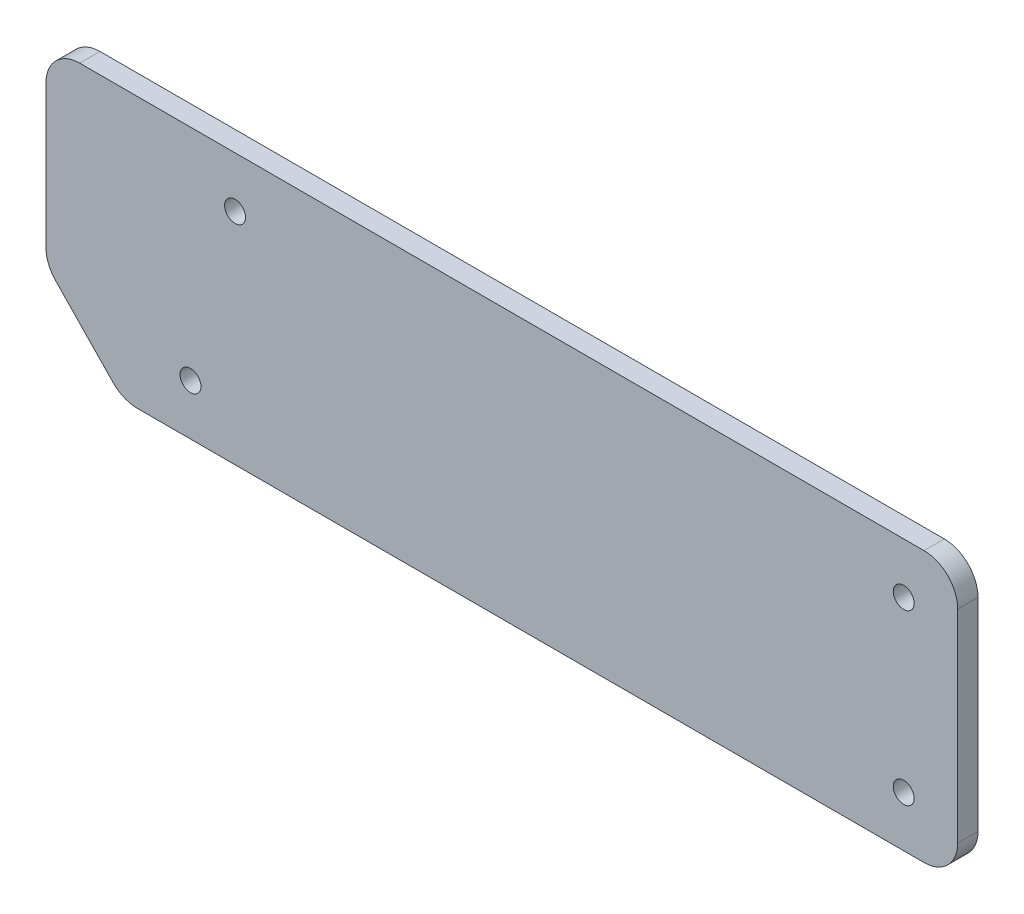
ISO-10303-21;
HEADER;
FILE_DESCRIPTION(('STEP AP214'),'2;1');
FILE_NAME('part.step','',(''),(''),'','','');
FILE_SCHEMA(('AUTOMOTIVE_DESIGN { 1 0 10303 214 1 1 1 1 }'));
ENDSEC;
DATA;
#1=APPLICATION_CONTEXT('core data for automotive mechanical design processes');
#2=APPLICATION_PROTOCOL_DEFINITION('international standard','automotive_design',2000,#1);
#3=PRODUCT_CONTEXT('',#1,'mechanical');
#4=PRODUCT('Part','Part','',(#3));
#5=PRODUCT_RELATED_PRODUCT_CATEGORY('part','',(#4));
#6=PRODUCT_DEFINITION_FORMATION('','',#4);
#7=PRODUCT_DEFINITION_CONTEXT('part definition',#1,'design');
#8=PRODUCT_DEFINITION('design','',#6,#7);
#9=PRODUCT_DEFINITION_SHAPE('','',#8);
#10=(LENGTH_UNIT() NAMED_UNIT(*) SI_UNIT(.MILLI.,.METRE.));
#11=(NAMED_UNIT(*) PLANE_ANGLE_UNIT() SI_UNIT($,.RADIAN.));
#12=(NAMED_UNIT(*) SI_UNIT($,.STERADIAN.) SOLID_ANGLE_UNIT());
#13=UNCERTAINTY_MEASURE_WITH_UNIT(LENGTH_MEASURE(1.E-05),#10,'distance_accuracy_value','');
#14=(GEOMETRIC_REPRESENTATION_CONTEXT(3) GLOBAL_UNCERTAINTY_ASSIGNED_CONTEXT((#13)) GLOBAL_UNIT_ASSIGNED_CONTEXT((#10,
#11,#12)) REPRESENTATION_CONTEXT('',''));
#15=CARTESIAN_POINT('',(0.,0.,0.));
#16=DIRECTION('',(0.,0.,1.));
#17=DIRECTION('',(1.,0.,0.));
#18=AXIS2_PLACEMENT_3D('',#15,#16,#17);
#19=CARTESIAN_POINT('',(135.,-40.,6.));
#20=DIRECTION('',(-1.,0.,0.));
#21=DIRECTION('',(0.,0.,1.));
#22=AXIS2_PLACEMENT_3D('',#19,#20,#21);
#23=PLANE('',#22);
#24=DIRECTION('',(0.,1.,0.));
#25=VECTOR('',#24,1.);
#26=CARTESIAN_POINT('',(135.,-40.,6.));
#27=LINE('',#26,#25);
#28=CARTESIAN_POINT('',(135.,-30.,6.));
#29=VERTEX_POINT('',#28);
#30=CARTESIAN_POINT('',(135.,30.,6.));
#31=VERTEX_POINT('',#30);
#32=EDGE_CURVE('E130',#29,#31,#27,.T.);
#33=ORIENTED_EDGE('',*,*,#32,.F.);
#34=DIRECTION('',(0.,0.,-1.));
#35=VECTOR('',#34,1.);
#36=CARTESIAN_POINT('',(135.,-30.,6.));
#37=LINE('',#36,#35);
#38=CARTESIAN_POINT('',(135.,-30.,0.));
#39=VERTEX_POINT('',#38);
#40=EDGE_CURVE('E118',#29,#39,#37,.T.);
#41=ORIENTED_EDGE('',*,*,#40,.T.);
#42=DIRECTION('',(0.,1.,0.));
#43=VECTOR('',#42,1.);
#44=CARTESIAN_POINT('',(135.,-40.,0.));
#45=LINE('',#44,#43);
#46=CARTESIAN_POINT('',(135.,30.,0.));
#47=VERTEX_POINT('',#46);
#48=EDGE_CURVE('E127',#39,#47,#45,.T.);
#49=ORIENTED_EDGE('',*,*,#48,.T.);
#50=DIRECTION('',(0.,0.,-1.));
#51=VECTOR('',#50,1.);
#52=CARTESIAN_POINT('',(135.,30.,6.));
#53=LINE('',#52,#51);
#54=EDGE_CURVE('E132',#47,#31,#53,.F.);
#55=ORIENTED_EDGE('',*,*,#54,.T.);
#56=EDGE_LOOP('',(#33,#41,#49,#55));
#57=FACE_BOUND('',#56,.T.);
#58=ADVANCED_FACE('F33',(#57),#23,.F.);
#59=CARTESIAN_POINT('',(-135.,40.,6.));
#60=DIRECTION('',(0.,-1.,0.));
#61=DIRECTION('',(0.,0.,-1.));
#62=AXIS2_PLACEMENT_3D('',#59,#60,#61);
#63=PLANE('',#62);
#64=DIRECTION('',(-1.,0.,0.));
#65=VECTOR('',#64,1.);
#66=CARTESIAN_POINT('',(-135.,40.,6.));
#67=LINE('',#66,#65);
#68=CARTESIAN_POINT('',(125.,40.,6.));
#69=VERTEX_POINT('',#68);
#70=CARTESIAN_POINT('',(-125.,40.,6.));
#71=VERTEX_POINT('',#70);
#72=EDGE_CURVE('E199',#69,#71,#67,.T.);
#73=ORIENTED_EDGE('',*,*,#72,.F.);
#74=DIRECTION('',(0.,0.,-1.));
#75=VECTOR('',#74,1.);
#76=CARTESIAN_POINT('',(125.,40.,6.));
#77=LINE('',#76,#75);
#78=CARTESIAN_POINT('',(125.,40.,0.));
#79=VERTEX_POINT('',#78);
#80=EDGE_CURVE('E168',#69,#79,#77,.T.);
#81=ORIENTED_EDGE('',*,*,#80,.T.);
#82=DIRECTION('',(-1.,0.,0.));
#83=VECTOR('',#82,1.);
#84=CARTESIAN_POINT('',(-135.,40.,0.));
#85=LINE('',#84,#83);
#86=CARTESIAN_POINT('',(-125.,40.,0.));
#87=VERTEX_POINT('',#86);
#88=EDGE_CURVE('E137',#79,#87,#85,.T.);
#89=ORIENTED_EDGE('',*,*,#88,.T.);
#90=DIRECTION('',(0.,0.,-1.));
#91=VECTOR('',#90,1.);
#92=CARTESIAN_POINT('',(-125.,40.,6.));
#93=LINE('',#92,#91);
#94=EDGE_CURVE('E166',#87,#71,#93,.F.);
#95=ORIENTED_EDGE('',*,*,#94,.T.);
#96=EDGE_LOOP('',(#73,#81,#89,#95));
#97=FACE_BOUND('',#96,.T.);
#98=ADVANCED_FACE('F234',(#97),#63,.F.);
#99=CARTESIAN_POINT('',(-135.,-40.,6.));
#100=DIRECTION('',(1.,0.,0.));
#101=DIRECTION('',(0.,0.,-1.));
#102=AXIS2_PLACEMENT_3D('',#99,#100,#101);
#103=PLANE('',#102);
#104=DIRECTION('',(0.,-1.,0.));
#105=VECTOR('',#104,1.);
#106=CARTESIAN_POINT('',(-135.,-40.,0.));
#107=LINE('',#106,#105);
#108=CARTESIAN_POINT('',(-135.,30.,0.));
#109=VERTEX_POINT('',#108);
#110=CARTESIAN_POINT('',(-135.,-12.3672281324068,0.));
#111=VERTEX_POINT('',#110);
#112=EDGE_CURVE('E141',#109,#111,#107,.T.);
#113=ORIENTED_EDGE('',*,*,#112,.T.);
#114=DIRECTION('',(0.,0.,1.));
#115=VECTOR('',#114,1.);
#116=CARTESIAN_POINT('',(-135.,-12.3672281324068,6.));
#117=LINE('',#116,#115);
#118=CARTESIAN_POINT('',(-135.,-12.3672281324068,6.));
#119=VERTEX_POINT('',#118);
#120=EDGE_CURVE('E11',#111,#119,#117,.T.);
#121=ORIENTED_EDGE('',*,*,#120,.T.);
#122=DIRECTION('',(0.,-1.,0.));
#123=VECTOR('',#122,1.);
#124=CARTESIAN_POINT('',(-135.,-40.,6.));
#125=LINE('',#124,#123);
#126=CARTESIAN_POINT('',(-135.,30.,6.));
#127=VERTEX_POINT('',#126);
#128=EDGE_CURVE('E197',#127,#119,#125,.T.);
#129=ORIENTED_EDGE('',*,*,#128,.F.);
#130=DIRECTION('',(0.,0.,-1.));
#131=VECTOR('',#130,1.);
#132=CARTESIAN_POINT('',(-135.,30.,6.));
#133=LINE('',#132,#131);
#134=EDGE_CURVE('E163',#127,#109,#133,.T.);
#135=ORIENTED_EDGE('',*,*,#134,.T.);
#136=EDGE_LOOP('',(#113,#121,#129,#135));
#137=FACE_BOUND('',#136,.T.);
#138=ADVANCED_FACE('F228',(#137),#103,.F.);
#139=CARTESIAN_POINT('',(-135.,-40.,6.));
#140=DIRECTION('',(0.,1.,0.));
#141=DIRECTION('',(0.,0.,1.));
#142=AXIS2_PLACEMENT_3D('',#139,#140,#141);
#143=PLANE('',#142);
#144=DIRECTION('',(1.,0.,0.));
#145=VECTOR('',#144,1.);
#146=CARTESIAN_POINT('',(-135.,-40.,6.));
#147=LINE('',#146,#145);
#148=CARTESIAN_POINT('',(-107.96628170011,-40.,6.));
#149=VERTEX_POINT('',#148);
#150=CARTESIAN_POINT('',(125.,-40.,6.));
#151=VERTEX_POINT('',#150);
#152=EDGE_CURVE('E147',#149,#151,#147,.T.);
#153=ORIENTED_EDGE('',*,*,#152,.F.);
#154=DIRECTION('',(0.,0.,1.));
#155=VECTOR('',#154,1.);
#156=CARTESIAN_POINT('',(-107.96628170011,-40.,6.));
#157=LINE('',#156,#155);
#158=CARTESIAN_POINT('',(-107.96628170011,-40.,0.));
#159=VERTEX_POINT('',#158);
#160=EDGE_CURVE('E56',#149,#159,#157,.F.);
#161=ORIENTED_EDGE('',*,*,#160,.T.);
#162=DIRECTION('',(1.,0.,0.));
#163=VECTOR('',#162,1.);
#164=CARTESIAN_POINT('',(-135.,-40.,0.));
#165=LINE('',#164,#163);
#166=CARTESIAN_POINT('',(125.,-40.,0.));
#167=VERTEX_POINT('',#166);
#168=EDGE_CURVE('E151',#159,#167,#165,.T.);
#169=ORIENTED_EDGE('',*,*,#168,.T.);
#170=DIRECTION('',(0.,0.,-1.));
#171=VECTOR('',#170,1.);
#172=CARTESIAN_POINT('',(125.,-40.,6.));
#173=LINE('',#172,#171);
#174=EDGE_CURVE('E120',#167,#151,#173,.F.);
#175=ORIENTED_EDGE('',*,*,#174,.T.);
#176=EDGE_LOOP('',(#153,#161,#169,#175));
#177=FACE_BOUND('',#176,.T.);
#178=ADVANCED_FACE('F196',(#177),#143,.F.);
#179=CARTESIAN_POINT('',(0.,0.,6.));
#180=DIRECTION('',(0.,0.,-1.));
#181=DIRECTION('',(-1.,0.,0.));
#182=AXIS2_PLACEMENT_3D('',#179,#180,#181);
#183=PLANE('',#182);
#184=CARTESIAN_POINT('',(-92.21,-25.,6.));
#185=DIRECTION('',(0.,0.,1.));
#186=DIRECTION('',(1.,0.,0.));
#187=AXIS2_PLACEMENT_3D('',#184,#185,#186);
#188=CIRCLE('',#187,3.09999999999999);
#189=CARTESIAN_POINT('',(-89.11,-25.,6.));
#190=VERTEX_POINT('',#189);
#191=EDGE_CURVE('E220',#190,#190,#188,.T.);
#192=ORIENTED_EDGE('',*,*,#191,.F.);
#193=EDGE_LOOP('',(#192));
#194=FACE_BOUND('',#193,.T.);
#195=CARTESIAN_POINT('',(119.,-25.,6.));
#196=DIRECTION('',(0.,0.,1.));
#197=DIRECTION('',(1.,0.,0.));
#198=AXIS2_PLACEMENT_3D('',#195,#196,#197);
#199=CIRCLE('',#198,3.1);
#200=CARTESIAN_POINT('',(122.1,-25.,6.));
#201=VERTEX_POINT('',#200);
#202=EDGE_CURVE('E214',#201,#201,#199,.T.);
#203=ORIENTED_EDGE('',*,*,#202,.F.);
#204=EDGE_LOOP('',(#203));
#205=FACE_BOUND('',#204,.T.);
#206=CARTESIAN_POINT('',(119.,25.,6.));
#207=DIRECTION('',(0.,0.,1.));
#208=DIRECTION('',(1.,0.,0.));
#209=AXIS2_PLACEMENT_3D('',#206,#207,#208);
#210=CIRCLE('',#209,3.1);
#211=CARTESIAN_POINT('',(122.1,25.,6.));
#212=VERTEX_POINT('',#211);
#213=EDGE_CURVE('E208',#212,#212,#210,.T.);
#214=ORIENTED_EDGE('',*,*,#213,.F.);
#215=EDGE_LOOP('',(#214));
#216=FACE_BOUND('',#215,.T.);
#217=CARTESIAN_POINT('',(-79.,25.,6.));
#218=DIRECTION('',(0.,0.,1.));
#219=DIRECTION('',(1.,0.,0.));
#220=AXIS2_PLACEMENT_3D('',#217,#218,#219);
#221=CIRCLE('',#220,3.09999999999999);
#222=CARTESIAN_POINT('',(-75.9,25.,6.));
#223=VERTEX_POINT('',#222);
#224=EDGE_CURVE('E144',#223,#223,#221,.T.);
#225=ORIENTED_EDGE('',*,*,#224,.F.);
#226=EDGE_LOOP('',(#225));
#227=FACE_BOUND('',#226,.T.);
#228=DIRECTION('',(-0.694783908357677,0.719218548625681,0.));
#229=VECTOR('',#228,1.);
#230=CARTESIAN_POINT('',(-112.21,-40.,6.));
#231=LINE('',#230,#229);
#232=CARTESIAN_POINT('',(-115.158467186367,-36.9478390835768,6.));
#233=VERTEX_POINT('',#232);
#234=CARTESIAN_POINT('',(-132.192185486257,-19.3150672159836,6.));
#235=VERTEX_POINT('',#234);
#236=EDGE_CURVE('E195',#233,#235,#231,.T.);
#237=ORIENTED_EDGE('',*,*,#236,.F.);
#238=CARTESIAN_POINT('',(-107.96628170011,-30.,6.));
#239=DIRECTION('',(0.,0.,-1.));
#240=DIRECTION('',(-1.,0.,0.));
#241=AXIS2_PLACEMENT_3D('',#238,#239,#240);
#242=CIRCLE('',#241,10.);
#243=EDGE_CURVE('E181',#233,#149,#242,.F.);
#244=ORIENTED_EDGE('',*,*,#243,.T.);
#245=ORIENTED_EDGE('',*,*,#152,.T.);
#246=CARTESIAN_POINT('',(125.,-30.,6.));
#247=DIRECTION('',(0.,0.,-1.));
#248=DIRECTION('',(-1.,0.,0.));
#249=AXIS2_PLACEMENT_3D('',#246,#247,#248);
#250=CIRCLE('',#249,10.);
#251=EDGE_CURVE('E161',#151,#29,#250,.F.);
#252=ORIENTED_EDGE('',*,*,#251,.T.);
#253=ORIENTED_EDGE('',*,*,#32,.T.);
#254=CARTESIAN_POINT('',(125.,30.,6.));
#255=DIRECTION('',(0.,0.,-1.));
#256=DIRECTION('',(-1.,0.,0.));
#257=AXIS2_PLACEMENT_3D('',#254,#255,#256);
#258=CIRCLE('',#257,10.);
#259=EDGE_CURVE('E159',#31,#69,#258,.F.);
#260=ORIENTED_EDGE('',*,*,#259,.T.);
#261=ORIENTED_EDGE('',*,*,#72,.T.);
#262=CARTESIAN_POINT('',(-125.,30.,6.));
#263=DIRECTION('',(0.,0.,-1.));
#264=DIRECTION('',(-1.,0.,0.));
#265=AXIS2_PLACEMENT_3D('',#262,#263,#264);
#266=CIRCLE('',#265,10.);
#267=EDGE_CURVE('E157',#71,#127,#266,.F.);
#268=ORIENTED_EDGE('',*,*,#267,.T.);
#269=ORIENTED_EDGE('',*,*,#128,.T.);
#270=CARTESIAN_POINT('',(-125.,-12.3672281324068,6.));
#271=DIRECTION('',(0.,0.,-1.));
#272=DIRECTION('',(-1.,0.,0.));
#273=AXIS2_PLACEMENT_3D('',#270,#271,#272);
#274=CIRCLE('',#273,10.);
#275=EDGE_CURVE('E179',#119,#235,#274,.F.);
#276=ORIENTED_EDGE('',*,*,#275,.T.);
#277=EDGE_LOOP('',(#237,#244,#245,#252,#253,#260,#261,#268,#269,#276));
#278=FACE_BOUND('',#277,.T.);
#279=ADVANCED_FACE('F194',(#194,#205,#216,#227,#278),#183,.F.);
#280=CARTESIAN_POINT('',(0.,0.,0.));
#281=DIRECTION('',(0.,0.,-1.));
#282=DIRECTION('',(-1.,0.,0.));
#283=AXIS2_PLACEMENT_3D('',#280,#281,#282);
#284=PLANE('',#283);
#285=ORIENTED_EDGE('',*,*,#168,.F.);
#286=CARTESIAN_POINT('',(-107.96628170011,-30.,0.));
#287=DIRECTION('',(0.,0.,-1.));
#288=DIRECTION('',(-1.,0.,0.));
#289=AXIS2_PLACEMENT_3D('',#286,#287,#288);
#290=CIRCLE('',#289,10.);
#291=CARTESIAN_POINT('',(-115.158467186367,-36.9478390835768,0.));
#292=VERTEX_POINT('',#291);
#293=EDGE_CURVE('E41',#159,#292,#290,.T.);
#294=ORIENTED_EDGE('',*,*,#293,.T.);
#295=DIRECTION('',(0.694783908357677,-0.719218548625681,0.));
#296=VECTOR('',#295,1.);
#297=CARTESIAN_POINT('',(-78.0315227014136,-75.3804895899665,0.));
#298=LINE('',#297,#296);
#299=CARTESIAN_POINT('',(-132.192185486257,-19.3150672159836,0.));
#300=VERTEX_POINT('',#299);
#301=EDGE_CURVE('E171',#300,#292,#298,.T.);
#302=ORIENTED_EDGE('',*,*,#301,.F.);
#303=CARTESIAN_POINT('',(-125.,-12.3672281324068,0.));
#304=DIRECTION('',(0.,0.,-1.));
#305=DIRECTION('',(-1.,0.,0.));
#306=AXIS2_PLACEMENT_3D('',#303,#304,#305);
#307=CIRCLE('',#306,10.);
#308=EDGE_CURVE('E48',#300,#111,#307,.T.);
#309=ORIENTED_EDGE('',*,*,#308,.T.);
#310=ORIENTED_EDGE('',*,*,#112,.F.);
#311=CARTESIAN_POINT('',(-125.,30.,0.));
#312=DIRECTION('',(0.,0.,-1.));
#313=DIRECTION('',(-1.,0.,0.));
#314=AXIS2_PLACEMENT_3D('',#311,#312,#313);
#315=CIRCLE('',#314,10.);
#316=EDGE_CURVE('E131',#109,#87,#315,.T.);
#317=ORIENTED_EDGE('',*,*,#316,.T.);
#318=ORIENTED_EDGE('',*,*,#88,.F.);
#319=CARTESIAN_POINT('',(125.,30.,0.));
#320=DIRECTION('',(0.,0.,-1.));
#321=DIRECTION('',(-1.,0.,0.));
#322=AXIS2_PLACEMENT_3D('',#319,#320,#321);
#323=CIRCLE('',#322,10.);
#324=EDGE_CURVE('E122',#79,#47,#323,.T.);
#325=ORIENTED_EDGE('',*,*,#324,.T.);
#326=ORIENTED_EDGE('',*,*,#48,.F.);
#327=CARTESIAN_POINT('',(125.,-30.,0.));
#328=DIRECTION('',(0.,0.,-1.));
#329=DIRECTION('',(-1.,0.,0.));
#330=AXIS2_PLACEMENT_3D('',#327,#328,#329);
#331=CIRCLE('',#330,10.);
#332=EDGE_CURVE('E114',#39,#167,#331,.T.);
#333=ORIENTED_EDGE('',*,*,#332,.T.);
#334=EDGE_LOOP('',(#285,#294,#302,#309,#310,#317,#318,#325,#326,#333));
#335=FACE_BOUND('',#334,.T.);
#336=CARTESIAN_POINT('',(-92.21,-25.,0.));
#337=DIRECTION('',(0.,0.,1.));
#338=DIRECTION('',(1.,0.,0.));
#339=AXIS2_PLACEMENT_3D('',#336,#337,#338);
#340=CIRCLE('',#339,3.09999999999999);
#341=CARTESIAN_POINT('',(-89.11,-25.,0.));
#342=VERTEX_POINT('',#341);
#343=EDGE_CURVE('E217',#342,#342,#340,.T.);
#344=ORIENTED_EDGE('',*,*,#343,.T.);
#345=EDGE_LOOP('',(#344));
#346=FACE_BOUND('',#345,.T.);
#347=CARTESIAN_POINT('',(119.,-25.,0.));
#348=DIRECTION('',(0.,0.,1.));
#349=DIRECTION('',(1.,0.,0.));
#350=AXIS2_PLACEMENT_3D('',#347,#348,#349);
#351=CIRCLE('',#350,3.1);
#352=CARTESIAN_POINT('',(122.1,-25.,0.));
#353=VERTEX_POINT('',#352);
#354=EDGE_CURVE('E211',#353,#353,#351,.T.);
#355=ORIENTED_EDGE('',*,*,#354,.T.);
#356=EDGE_LOOP('',(#355));
#357=FACE_BOUND('',#356,.T.);
#358=CARTESIAN_POINT('',(119.,25.,0.));
#359=DIRECTION('',(0.,0.,1.));
#360=DIRECTION('',(1.,0.,0.));
#361=AXIS2_PLACEMENT_3D('',#358,#359,#360);
#362=CIRCLE('',#361,3.1);
#363=CARTESIAN_POINT('',(122.1,25.,0.));
#364=VERTEX_POINT('',#363);
#365=EDGE_CURVE('E206',#364,#364,#362,.T.);
#366=ORIENTED_EDGE('',*,*,#365,.T.);
#367=EDGE_LOOP('',(#366));
#368=FACE_BOUND('',#367,.T.);
#369=CARTESIAN_POINT('',(-79.,25.,0.));
#370=DIRECTION('',(0.,0.,1.));
#371=DIRECTION('',(1.,0.,0.));
#372=AXIS2_PLACEMENT_3D('',#369,#370,#371);
#373=CIRCLE('',#372,3.09999999999999);
#374=CARTESIAN_POINT('',(-75.9,25.,0.));
#375=VERTEX_POINT('',#374);
#376=EDGE_CURVE('E138',#375,#375,#373,.T.);
#377=ORIENTED_EDGE('',*,*,#376,.T.);
#378=EDGE_LOOP('',(#377));
#379=FACE_BOUND('',#378,.T.);
#380=ADVANCED_FACE('F134',(#335,#346,#357,#368,#379),#284,.T.);
#381=CARTESIAN_POINT('',(-79.,25.,0.));
#382=DIRECTION('',(0.,0.,1.));
#383=DIRECTION('',(1.,0.,0.));
#384=AXIS2_PLACEMENT_3D('',#381,#382,#383);
#385=CYLINDRICAL_SURFACE('',#384,3.09999999999999);
#386=ORIENTED_EDGE('',*,*,#376,.F.);
#387=EDGE_LOOP('',(#386));
#388=FACE_BOUND('',#387,.T.);
#389=ORIENTED_EDGE('',*,*,#224,.T.);
#390=EDGE_LOOP('',(#389));
#391=FACE_BOUND('',#390,.T.);
#392=ADVANCED_FACE('F263',(#388,#391),#385,.F.);
#393=CARTESIAN_POINT('',(119.,25.,0.));
#394=DIRECTION('',(0.,0.,1.));
#395=DIRECTION('',(1.,0.,0.));
#396=AXIS2_PLACEMENT_3D('',#393,#394,#395);
#397=CYLINDRICAL_SURFACE('',#396,3.1);
#398=ORIENTED_EDGE('',*,*,#365,.F.);
#399=EDGE_LOOP('',(#398));
#400=FACE_BOUND('',#399,.T.);
#401=ORIENTED_EDGE('',*,*,#213,.T.);
#402=EDGE_LOOP('',(#401));
#403=FACE_BOUND('',#402,.T.);
#404=ADVANCED_FACE('F269',(#400,#403),#397,.F.);
#405=CARTESIAN_POINT('',(119.,-25.,0.));
#406=DIRECTION('',(0.,0.,1.));
#407=DIRECTION('',(1.,0.,0.));
#408=AXIS2_PLACEMENT_3D('',#405,#406,#407);
#409=CYLINDRICAL_SURFACE('',#408,3.1);
#410=ORIENTED_EDGE('',*,*,#354,.F.);
#411=EDGE_LOOP('',(#410));
#412=FACE_BOUND('',#411,.T.);
#413=ORIENTED_EDGE('',*,*,#202,.T.);
#414=EDGE_LOOP('',(#413));
#415=FACE_BOUND('',#414,.T.);
#416=ADVANCED_FACE('F273',(#412,#415),#409,.F.);
#417=CARTESIAN_POINT('',(-92.21,-25.,0.));
#418=DIRECTION('',(0.,0.,1.));
#419=DIRECTION('',(1.,0.,0.));
#420=AXIS2_PLACEMENT_3D('',#417,#418,#419);
#421=CYLINDRICAL_SURFACE('',#420,3.09999999999999);
#422=ORIENTED_EDGE('',*,*,#343,.F.);
#423=EDGE_LOOP('',(#422));
#424=FACE_BOUND('',#423,.T.);
#425=ORIENTED_EDGE('',*,*,#191,.T.);
#426=EDGE_LOOP('',(#425));
#427=FACE_BOUND('',#426,.T.);
#428=ADVANCED_FACE('F248',(#424,#427),#421,.F.);
#429=CARTESIAN_POINT('',(125.,-30.,6.));
#430=DIRECTION('',(0.,0.,-1.));
#431=DIRECTION('',(-1.,0.,0.));
#432=AXIS2_PLACEMENT_3D('',#429,#430,#431);
#433=CYLINDRICAL_SURFACE('',#432,10.);
#434=ORIENTED_EDGE('',*,*,#251,.F.);
#435=ORIENTED_EDGE('',*,*,#174,.F.);
#436=ORIENTED_EDGE('',*,*,#332,.F.);
#437=ORIENTED_EDGE('',*,*,#40,.F.);
#438=EDGE_LOOP('',(#434,#435,#436,#437));
#439=FACE_BOUND('',#438,.T.);
#440=ADVANCED_FACE('F117',(#439),#433,.T.);
#441=CARTESIAN_POINT('',(125.,30.,6.));
#442=DIRECTION('',(0.,0.,-1.));
#443=DIRECTION('',(-1.,0.,0.));
#444=AXIS2_PLACEMENT_3D('',#441,#442,#443);
#445=CYLINDRICAL_SURFACE('',#444,10.);
#446=ORIENTED_EDGE('',*,*,#259,.F.);
#447=ORIENTED_EDGE('',*,*,#54,.F.);
#448=ORIENTED_EDGE('',*,*,#324,.F.);
#449=ORIENTED_EDGE('',*,*,#80,.F.);
#450=EDGE_LOOP('',(#446,#447,#448,#449));
#451=FACE_BOUND('',#450,.T.);
#452=ADVANCED_FACE('F240',(#451),#445,.T.);
#453=CARTESIAN_POINT('',(-125.,30.,6.));
#454=DIRECTION('',(0.,0.,-1.));
#455=DIRECTION('',(-1.,0.,0.));
#456=AXIS2_PLACEMENT_3D('',#453,#454,#455);
#457=CYLINDRICAL_SURFACE('',#456,10.);
#458=ORIENTED_EDGE('',*,*,#267,.F.);
#459=ORIENTED_EDGE('',*,*,#94,.F.);
#460=ORIENTED_EDGE('',*,*,#316,.F.);
#461=ORIENTED_EDGE('',*,*,#134,.F.);
#462=EDGE_LOOP('',(#458,#459,#460,#461));
#463=FACE_BOUND('',#462,.T.);
#464=ADVANCED_FACE('F237',(#463),#457,.T.);
#465=CARTESIAN_POINT('',(-112.21,-40.,-4.));
#466=DIRECTION('',(0.719218548625681,0.694783908357677,0.));
#467=DIRECTION('',(-0.694783908357677,0.719218548625681,0.));
#468=AXIS2_PLACEMENT_3D('',#465,#466,#467);
#469=PLANE('',#468);
#470=ORIENTED_EDGE('',*,*,#301,.T.);
#471=DIRECTION('',(0.,0.,1.));
#472=VECTOR('',#471,1.);
#473=CARTESIAN_POINT('',(-115.158467186367,-36.9478390835768,-4.));
#474=LINE('',#473,#472);
#475=EDGE_CURVE('E176',#292,#233,#474,.T.);
#476=ORIENTED_EDGE('',*,*,#475,.T.);
#477=ORIENTED_EDGE('',*,*,#236,.T.);
#478=DIRECTION('',(0.,0.,1.));
#479=VECTOR('',#478,1.);
#480=CARTESIAN_POINT('',(-132.192185486257,-19.3150672159836,-4.));
#481=LINE('',#480,#479);
#482=EDGE_CURVE('E174',#235,#300,#481,.F.);
#483=ORIENTED_EDGE('',*,*,#482,.T.);
#484=EDGE_LOOP('',(#470,#476,#477,#483));
#485=FACE_BOUND('',#484,.T.);
#486=ADVANCED_FACE('F188',(#485),#469,.F.);
#487=CARTESIAN_POINT('',(-107.96628170011,-30.,-4.));
#488=DIRECTION('',(0.,0.,1.));
#489=DIRECTION('',(1.,0.,0.));
#490=AXIS2_PLACEMENT_3D('',#487,#488,#489);
#491=CYLINDRICAL_SURFACE('',#490,10.);
#492=ORIENTED_EDGE('',*,*,#293,.F.);
#493=ORIENTED_EDGE('',*,*,#160,.F.);
#494=ORIENTED_EDGE('',*,*,#243,.F.);
#495=ORIENTED_EDGE('',*,*,#475,.F.);
#496=EDGE_LOOP('',(#492,#493,#494,#495));
#497=FACE_BOUND('',#496,.T.);
#498=ADVANCED_FACE('F192',(#497),#491,.T.);
#499=CARTESIAN_POINT('',(-125.,-12.3672281324068,6.));
#500=DIRECTION('',(0.,0.,1.));
#501=DIRECTION('',(1.,0.,0.));
#502=AXIS2_PLACEMENT_3D('',#499,#500,#501);
#503=CYLINDRICAL_SURFACE('',#502,10.);
#504=ORIENTED_EDGE('',*,*,#308,.F.);
#505=ORIENTED_EDGE('',*,*,#482,.F.);
#506=ORIENTED_EDGE('',*,*,#275,.F.);
#507=ORIENTED_EDGE('',*,*,#120,.F.);
#508=EDGE_LOOP('',(#504,#505,#506,#507));
#509=FACE_BOUND('',#508,.T.);
#510=ADVANCED_FACE('F35',(#509),#503,.T.);
#511=CLOSED_SHELL('',(#58,#98,#138,#178,#279,#380,#392,#404,#416,#428,#440,#452,#464,#486,#498,#510));
#512=MANIFOLD_SOLID_BREP('B2',#511);
#513=ADVANCED_BREP_SHAPE_REPRESENTATION('',(#18,#512),#14);
#514=SHAPE_DEFINITION_REPRESENTATION(#9,#513);
ENDSEC;
END-ISO-10303-21;
